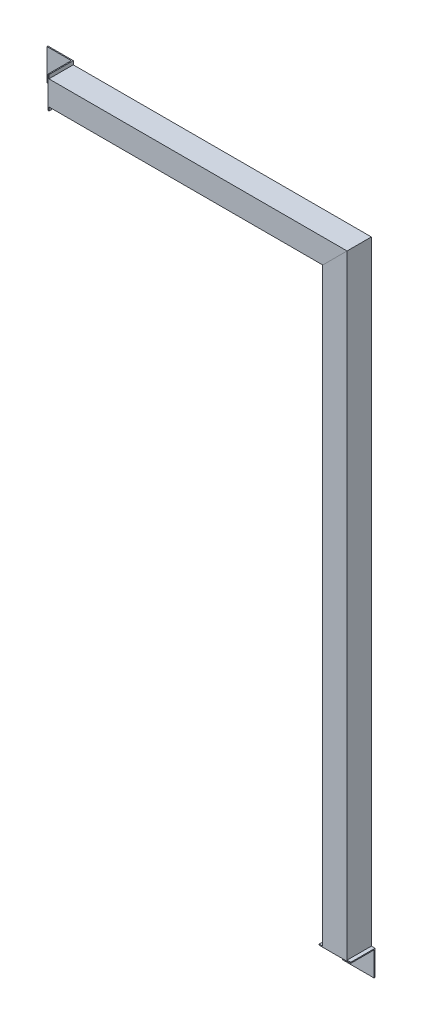
ISO-10303-21;
HEADER;
FILE_DESCRIPTION(('STEP AP214'),'2;1');
FILE_NAME('part.step','',(''),(''),'','','');
FILE_SCHEMA(('AUTOMOTIVE_DESIGN { 1 0 10303 214 1 1 1 1 }'));
ENDSEC;
DATA;
#1=APPLICATION_CONTEXT('core data for automotive mechanical design processes');
#2=APPLICATION_PROTOCOL_DEFINITION('international standard','automotive_design',2000,#1);
#3=PRODUCT_CONTEXT('',#1,'mechanical');
#4=PRODUCT('Part','Part','',(#3));
#5=PRODUCT_RELATED_PRODUCT_CATEGORY('part','',(#4));
#6=PRODUCT_DEFINITION_FORMATION('','',#4);
#7=PRODUCT_DEFINITION_CONTEXT('part definition',#1,'design');
#8=PRODUCT_DEFINITION('design','',#6,#7);
#9=PRODUCT_DEFINITION_SHAPE('','',#8);
#10=(LENGTH_UNIT() NAMED_UNIT(*) SI_UNIT(.MILLI.,.METRE.));
#11=(NAMED_UNIT(*) PLANE_ANGLE_UNIT() SI_UNIT($,.RADIAN.));
#12=(NAMED_UNIT(*) SI_UNIT($,.STERADIAN.) SOLID_ANGLE_UNIT());
#13=UNCERTAINTY_MEASURE_WITH_UNIT(LENGTH_MEASURE(1.E-05),#10,'distance_accuracy_value','');
#14=(GEOMETRIC_REPRESENTATION_CONTEXT(3) GLOBAL_UNCERTAINTY_ASSIGNED_CONTEXT((#13)) GLOBAL_UNIT_ASSIGNED_CONTEXT((#10,
#11,#12)) REPRESENTATION_CONTEXT('',''));
#15=CARTESIAN_POINT('',(0.,0.,0.));
#16=DIRECTION('',(0.,0.,1.));
#17=DIRECTION('',(1.,0.,0.));
#18=AXIS2_PLACEMENT_3D('',#15,#16,#17);
#19=CARTESIAN_POINT('',(-57.5,-50.,23.));
#20=DIRECTION('',(0.,-1.,0.));
#21=DIRECTION('',(1.,0.,0.));
#22=AXIS2_PLACEMENT_3D('',#19,#20,#21);
#23=PLANE('',#22);
#24=DIRECTION('',(0.,0.,1.));
#25=VECTOR('',#24,1.);
#26=CARTESIAN_POINT('',(7.50000000000001,-50.,23.));
#27=LINE('',#26,#25);
#28=CARTESIAN_POINT('',(7.50000000000001,-50.,-25.));
#29=VERTEX_POINT('',#28);
#30=CARTESIAN_POINT('',(7.50000000000001,-50.,-22.9999999999998));
#31=VERTEX_POINT('',#30);
#32=EDGE_CURVE('E232',#29,#31,#27,.T.);
#33=ORIENTED_EDGE('',*,*,#32,.T.);
#34=DIRECTION('',(-1.,0.,0.));
#35=VECTOR('',#34,1.);
#36=CARTESIAN_POINT('',(-57.5,-50.,-22.9999999999998));
#37=LINE('',#36,#35);
#38=CARTESIAN_POINT('',(-57.5,-50.,-22.9999999999998));
#39=VERTEX_POINT('',#38);
#40=EDGE_CURVE('E441',#31,#39,#37,.T.);
#41=ORIENTED_EDGE('',*,*,#40,.T.);
#42=DIRECTION('',(0.,0.,1.));
#43=VECTOR('',#42,1.);
#44=CARTESIAN_POINT('',(-57.5,-50.,23.));
#45=LINE('',#44,#43);
#46=CARTESIAN_POINT('',(-57.5,-50.,-25.));
#47=VERTEX_POINT('',#46);
#48=EDGE_CURVE('E229',#47,#39,#45,.T.);
#49=ORIENTED_EDGE('',*,*,#48,.F.);
#50=DIRECTION('',(1.,0.,0.));
#51=VECTOR('',#50,1.);
#52=CARTESIAN_POINT('',(7.50000000000002,-50.,-25.));
#53=LINE('',#52,#51);
#54=EDGE_CURVE('E419',#47,#29,#53,.T.);
#55=ORIENTED_EDGE('',*,*,#54,.T.);
#56=EDGE_LOOP('',(#33,#41,#49,#55));
#57=FACE_BOUND('',#56,.T.);
#58=ADVANCED_FACE('F41',(#57),#23,.T.);
#59=CARTESIAN_POINT('',(-665.,1272.5,23.));
#60=DIRECTION('',(-1.,0.,0.));
#61=DIRECTION('',(0.,0.,1.));
#62=AXIS2_PLACEMENT_3D('',#59,#60,#61);
#63=PLANE('',#62);
#64=DIRECTION('',(0.,0.,1.));
#65=VECTOR('',#64,1.);
#66=CARTESIAN_POINT('',(-665.,1207.5,23.));
#67=LINE('',#66,#65);
#68=CARTESIAN_POINT('',(-665.,1207.5,-24.9999999999999));
#69=VERTEX_POINT('',#68);
#70=CARTESIAN_POINT('',(-665.,1207.5,-23.));
#71=VERTEX_POINT('',#70);
#72=EDGE_CURVE('E356',#69,#71,#67,.T.);
#73=ORIENTED_EDGE('',*,*,#72,.T.);
#74=DIRECTION('',(0.,1.,0.));
#75=VECTOR('',#74,1.);
#76=CARTESIAN_POINT('',(-665.,1272.5,-23.));
#77=LINE('',#76,#75);
#78=CARTESIAN_POINT('',(-665.,1272.5,-23.));
#79=VERTEX_POINT('',#78);
#80=EDGE_CURVE('E65',#71,#79,#77,.T.);
#81=ORIENTED_EDGE('',*,*,#80,.T.);
#82=DIRECTION('',(0.,0.,1.));
#83=VECTOR('',#82,1.);
#84=CARTESIAN_POINT('',(-665.,1272.5,23.));
#85=LINE('',#84,#83);
#86=CARTESIAN_POINT('',(-665.,1272.5,-24.9999999999999));
#87=VERTEX_POINT('',#86);
#88=EDGE_CURVE('E234',#87,#79,#85,.T.);
#89=ORIENTED_EDGE('',*,*,#88,.F.);
#90=DIRECTION('',(0.,-1.,0.));
#91=VECTOR('',#90,1.);
#92=CARTESIAN_POINT('',(-665.,1207.5,-24.9999999999999));
#93=LINE('',#92,#91);
#94=EDGE_CURVE('E363',#87,#69,#93,.T.);
#95=ORIENTED_EDGE('',*,*,#94,.T.);
#96=EDGE_LOOP('',(#73,#81,#89,#95));
#97=FACE_BOUND('',#96,.T.);
#98=ADVANCED_FACE('F361',(#97),#63,.T.);
#99=CARTESIAN_POINT('',(0.,1265.,25.));
#100=DIRECTION('',(-1.,0.,0.));
#101=DIRECTION('',(0.,0.,1.));
#102=AXIS2_PLACEMENT_3D('',#99,#100,#101);
#103=PLANE('',#102);
#104=DIRECTION('',(0.,-1.,0.));
#105=VECTOR('',#104,1.);
#106=CARTESIAN_POINT('',(0.,1265.,25.));
#107=LINE('',#106,#105);
#108=CARTESIAN_POINT('',(0.,1265.,25.));
#109=VERTEX_POINT('',#108);
#110=CARTESIAN_POINT('',(0.,2.,25.));
#111=VERTEX_POINT('',#110);
#112=EDGE_CURVE('E285',#109,#111,#107,.T.);
#113=ORIENTED_EDGE('',*,*,#112,.T.);
#114=DIRECTION('',(0.,0.,-1.));
#115=VECTOR('',#114,1.);
#116=CARTESIAN_POINT('',(0.,2.,25.));
#117=LINE('',#116,#115);
#118=CARTESIAN_POINT('',(0.,2.,-24.9999999999998));
#119=VERTEX_POINT('',#118);
#120=EDGE_CURVE('E393',#111,#119,#117,.T.);
#121=ORIENTED_EDGE('',*,*,#120,.T.);
#122=DIRECTION('',(0.,-1.,0.));
#123=VECTOR('',#122,1.);
#124=CARTESIAN_POINT('',(0.,1265.,-25.));
#125=LINE('',#124,#123);
#126=CARTESIAN_POINT('',(0.,1265.,-25.));
#127=VERTEX_POINT('',#126);
#128=EDGE_CURVE('E296',#127,#119,#125,.T.);
#129=ORIENTED_EDGE('',*,*,#128,.F.);
#130=DIRECTION('',(0.,0.,-1.));
#131=VECTOR('',#130,1.);
#132=CARTESIAN_POINT('',(0.,1265.,25.));
#133=LINE('',#132,#131);
#134=EDGE_CURVE('E275',#109,#127,#133,.T.);
#135=ORIENTED_EDGE('',*,*,#134,.F.);
#136=EDGE_LOOP('',(#113,#121,#129,#135));
#137=FACE_BOUND('',#136,.T.);
#138=ADVANCED_FACE('F467',(#137),#103,.F.);
#139=CARTESIAN_POINT('',(-50.,1265.,-25.));
#140=DIRECTION('',(0.,0.,1.));
#141=DIRECTION('',(1.,0.,0.));
#142=AXIS2_PLACEMENT_3D('',#139,#140,#141);
#143=PLANE('',#142);
#144=ORIENTED_EDGE('',*,*,#128,.T.);
#145=DIRECTION('',(1.,0.,0.));
#146=VECTOR('',#145,1.);
#147=CARTESIAN_POINT('',(-57.5,2.,-24.9999999999998));
#148=LINE('',#147,#146);
#149=CARTESIAN_POINT('',(7.50000000000001,2.,-24.9999999999998));
#150=VERTEX_POINT('',#149);
#151=EDGE_CURVE('E417',#119,#150,#148,.T.);
#152=ORIENTED_EDGE('',*,*,#151,.T.);
#153=DIRECTION('',(0.,-1.,0.));
#154=VECTOR('',#153,1.);
#155=CARTESIAN_POINT('',(7.50000000000001,0.,-24.9999999999998));
#156=LINE('',#155,#154);
#157=EDGE_CURVE('E410',#150,#29,#156,.T.);
#158=ORIENTED_EDGE('',*,*,#157,.T.);
#159=ORIENTED_EDGE('',*,*,#54,.F.);
#160=DIRECTION('',(0.,1.,0.));
#161=VECTOR('',#160,1.);
#162=CARTESIAN_POINT('',(-57.5,0.,-24.9999999999998));
#163=LINE('',#162,#161);
#164=CARTESIAN_POINT('',(-57.5,2.,-24.9999999999998));
#165=VERTEX_POINT('',#164);
#166=EDGE_CURVE('E404',#47,#165,#163,.T.);
#167=ORIENTED_EDGE('',*,*,#166,.T.);
#168=CARTESIAN_POINT('',(-50.,2.,-25.));
#169=VERTEX_POINT('',#168);
#170=EDGE_CURVE('E414',#165,#169,#148,.T.);
#171=ORIENTED_EDGE('',*,*,#170,.T.);
#172=DIRECTION('',(0.,-1.,0.));
#173=VECTOR('',#172,1.);
#174=CARTESIAN_POINT('',(-50.,1265.,-25.));
#175=LINE('',#174,#173);
#176=CARTESIAN_POINT('',(-50.0000000000003,1215.,-25.));
#177=VERTEX_POINT('',#176);
#178=EDGE_CURVE('E299',#177,#169,#175,.T.);
#179=ORIENTED_EDGE('',*,*,#178,.F.);
#180=DIRECTION('',(0.707106781186548,0.707106781186548,0.));
#181=VECTOR('',#180,1.);
#182=CARTESIAN_POINT('',(-332.5,932.5,-25.));
#183=LINE('',#182,#181);
#184=EDGE_CURVE('E288',#177,#127,#183,.T.);
#185=ORIENTED_EDGE('',*,*,#184,.T.);
#186=EDGE_LOOP('',(#144,#152,#158,#159,#167,#171,#179,#185));
#187=FACE_BOUND('',#186,.T.);
#188=ADVANCED_FACE('F450',(#187),#143,.F.);
#189=CARTESIAN_POINT('',(-50.,1265.,25.));
#190=DIRECTION('',(1.,0.,0.));
#191=DIRECTION('',(0.,1.,0.));
#192=AXIS2_PLACEMENT_3D('',#189,#190,#191);
#193=PLANE('',#192);
#194=ORIENTED_EDGE('',*,*,#178,.T.);
#195=DIRECTION('',(0.,0.,1.));
#196=VECTOR('',#195,1.);
#197=CARTESIAN_POINT('',(-50.,2.,25.));
#198=LINE('',#197,#196);
#199=CARTESIAN_POINT('',(-50.,2.,25.));
#200=VERTEX_POINT('',#199);
#201=EDGE_CURVE('E396',#169,#200,#198,.T.);
#202=ORIENTED_EDGE('',*,*,#201,.T.);
#203=DIRECTION('',(0.,-1.,0.));
#204=VECTOR('',#203,1.);
#205=CARTESIAN_POINT('',(-50.,1265.,25.));
#206=LINE('',#205,#204);
#207=CARTESIAN_POINT('',(-50.0000000000002,1215.,25.));
#208=VERTEX_POINT('',#207);
#209=EDGE_CURVE('E239',#208,#200,#206,.T.);
#210=ORIENTED_EDGE('',*,*,#209,.F.);
#211=DIRECTION('',(0.,0.,-1.));
#212=VECTOR('',#211,1.);
#213=CARTESIAN_POINT('',(-50.0000000000004,1215.,25.));
#214=LINE('',#213,#212);
#215=EDGE_CURVE('E284',#208,#177,#214,.T.);
#216=ORIENTED_EDGE('',*,*,#215,.T.);
#217=EDGE_LOOP('',(#194,#202,#210,#216));
#218=FACE_BOUND('',#217,.T.);
#219=ADVANCED_FACE('F514',(#218),#193,.F.);
#220=CARTESIAN_POINT('',(-50.,1265.,25.));
#221=DIRECTION('',(0.,0.,-1.));
#222=DIRECTION('',(-1.,0.,0.));
#223=AXIS2_PLACEMENT_3D('',#220,#221,#222);
#224=PLANE('',#223);
#225=DIRECTION('',(0.,-1.,0.));
#226=VECTOR('',#225,1.);
#227=CARTESIAN_POINT('',(-57.5,0.,25.));
#228=LINE('',#227,#226);
#229=CARTESIAN_POINT('',(-57.5,2.,25.));
#230=VERTEX_POINT('',#229);
#231=CARTESIAN_POINT('',(-57.5,0.,25.));
#232=VERTEX_POINT('',#231);
#233=EDGE_CURVE('E222',#230,#232,#228,.T.);
#234=ORIENTED_EDGE('',*,*,#233,.T.);
#235=DIRECTION('',(-1.,0.,0.));
#236=VECTOR('',#235,1.);
#237=CARTESIAN_POINT('',(-57.5,0.,25.));
#238=LINE('',#237,#236);
#239=CARTESIAN_POINT('',(7.50000000000001,0.,25.));
#240=VERTEX_POINT('',#239);
#241=EDGE_CURVE('E207',#240,#232,#238,.T.);
#242=ORIENTED_EDGE('',*,*,#241,.F.);
#243=DIRECTION('',(0.,1.,0.));
#244=VECTOR('',#243,1.);
#245=CARTESIAN_POINT('',(7.49999999999999,0.,25.));
#246=LINE('',#245,#244);
#247=CARTESIAN_POINT('',(7.50000000000001,2.,25.));
#248=VERTEX_POINT('',#247);
#249=EDGE_CURVE('E219',#240,#248,#246,.T.);
#250=ORIENTED_EDGE('',*,*,#249,.T.);
#251=DIRECTION('',(-1.,0.,0.));
#252=VECTOR('',#251,1.);
#253=CARTESIAN_POINT('',(-57.5,2.,25.));
#254=LINE('',#253,#252);
#255=EDGE_CURVE('E407',#248,#111,#254,.T.);
#256=ORIENTED_EDGE('',*,*,#255,.T.);
#257=ORIENTED_EDGE('',*,*,#112,.F.);
#258=DIRECTION('',(-0.707106781186548,-0.707106781186548,0.));
#259=VECTOR('',#258,1.);
#260=CARTESIAN_POINT('',(-332.5,932.5,25.));
#261=LINE('',#260,#259);
#262=EDGE_CURVE('E281',#109,#208,#261,.T.);
#263=ORIENTED_EDGE('',*,*,#262,.T.);
#264=ORIENTED_EDGE('',*,*,#209,.T.);
#265=EDGE_CURVE('E412',#200,#230,#254,.T.);
#266=ORIENTED_EDGE('',*,*,#265,.T.);
#267=EDGE_LOOP('',(#234,#242,#250,#256,#257,#263,#264,#266));
#268=FACE_BOUND('',#267,.T.);
#269=ADVANCED_FACE('F43',(#268),#224,.F.);
#270=CARTESIAN_POINT('',(-615.,1265.,25.));
#271=DIRECTION('',(0.,-1.,0.));
#272=DIRECTION('',(0.,0.,-1.));
#273=AXIS2_PLACEMENT_3D('',#270,#271,#272);
#274=PLANE('',#273);
#275=DIRECTION('',(1.,0.,0.));
#276=VECTOR('',#275,1.);
#277=CARTESIAN_POINT('',(-615.,1265.,-25.));
#278=LINE('',#277,#276);
#279=CARTESIAN_POINT('',(-613.,1265.,-25.));
#280=VERTEX_POINT('',#279);
#281=EDGE_CURVE('E276',#280,#127,#278,.T.);
#282=ORIENTED_EDGE('',*,*,#281,.F.);
#283=DIRECTION('',(0.,0.,1.));
#284=VECTOR('',#283,1.);
#285=CARTESIAN_POINT('',(-613.,1265.,25.));
#286=LINE('',#285,#284);
#287=CARTESIAN_POINT('',(-613.,1265.,25.));
#288=VERTEX_POINT('',#287);
#289=EDGE_CURVE('E348',#280,#288,#286,.T.);
#290=ORIENTED_EDGE('',*,*,#289,.T.);
#291=DIRECTION('',(1.,0.,0.));
#292=VECTOR('',#291,1.);
#293=CARTESIAN_POINT('',(-615.,1265.,25.));
#294=LINE('',#293,#292);
#295=EDGE_CURVE('E266',#288,#109,#294,.T.);
#296=ORIENTED_EDGE('',*,*,#295,.T.);
#297=ORIENTED_EDGE('',*,*,#134,.T.);
#298=EDGE_LOOP('',(#282,#290,#296,#297));
#299=FACE_BOUND('',#298,.T.);
#300=ADVANCED_FACE('F497',(#299),#274,.F.);
#301=CARTESIAN_POINT('',(-615.,1215.,-25.));
#302=DIRECTION('',(0.,0.,1.));
#303=DIRECTION('',(0.,-1.,0.));
#304=AXIS2_PLACEMENT_3D('',#301,#302,#303);
#305=PLANE('',#304);
#306=DIRECTION('',(1.,0.,0.));
#307=VECTOR('',#306,1.);
#308=CARTESIAN_POINT('',(-615.,1215.,-25.));
#309=LINE('',#308,#307);
#310=CARTESIAN_POINT('',(-613.,1215.,-25.));
#311=VERTEX_POINT('',#310);
#312=EDGE_CURVE('E278',#311,#177,#309,.T.);
#313=ORIENTED_EDGE('',*,*,#312,.F.);
#314=DIRECTION('',(0.,-1.,0.));
#315=VECTOR('',#314,1.);
#316=CARTESIAN_POINT('',(-613.,1272.5,-25.));
#317=LINE('',#316,#315);
#318=CARTESIAN_POINT('',(-613.,1207.5,-25.));
#319=VERTEX_POINT('',#318);
#320=EDGE_CURVE('E373',#311,#319,#317,.T.);
#321=ORIENTED_EDGE('',*,*,#320,.T.);
#322=DIRECTION('',(-1.,0.,0.));
#323=VECTOR('',#322,1.);
#324=CARTESIAN_POINT('',(-615.,1207.5,-25.));
#325=LINE('',#324,#323);
#326=EDGE_CURVE('E336',#319,#69,#325,.T.);
#327=ORIENTED_EDGE('',*,*,#326,.T.);
#328=ORIENTED_EDGE('',*,*,#94,.F.);
#329=DIRECTION('',(1.,0.,0.));
#330=VECTOR('',#329,1.);
#331=CARTESIAN_POINT('',(-615.,1272.5,-25.));
#332=LINE('',#331,#330);
#333=CARTESIAN_POINT('',(-613.,1272.5,-25.));
#334=VERTEX_POINT('',#333);
#335=EDGE_CURVE('E340',#87,#334,#332,.T.);
#336=ORIENTED_EDGE('',*,*,#335,.T.);
#337=EDGE_CURVE('E377',#334,#280,#317,.T.);
#338=ORIENTED_EDGE('',*,*,#337,.T.);
#339=ORIENTED_EDGE('',*,*,#281,.T.);
#340=ORIENTED_EDGE('',*,*,#184,.F.);
#341=EDGE_LOOP('',(#313,#321,#327,#328,#336,#338,#339,#340));
#342=FACE_BOUND('',#341,.T.);
#343=ADVANCED_FACE('F372',(#342),#305,.F.);
#344=CARTESIAN_POINT('',(-615.,1215.,25.));
#345=DIRECTION('',(0.,1.,0.));
#346=DIRECTION('',(0.,0.,1.));
#347=AXIS2_PLACEMENT_3D('',#344,#345,#346);
#348=PLANE('',#347);
#349=DIRECTION('',(1.,0.,0.));
#350=VECTOR('',#349,1.);
#351=CARTESIAN_POINT('',(-615.,1215.,25.));
#352=LINE('',#351,#350);
#353=CARTESIAN_POINT('',(-613.,1215.,25.));
#354=VERTEX_POINT('',#353);
#355=EDGE_CURVE('E291',#354,#208,#352,.T.);
#356=ORIENTED_EDGE('',*,*,#355,.F.);
#357=DIRECTION('',(0.,0.,-1.));
#358=VECTOR('',#357,1.);
#359=CARTESIAN_POINT('',(-613.,1215.,25.));
#360=LINE('',#359,#358);
#361=EDGE_CURVE('E345',#354,#311,#360,.T.);
#362=ORIENTED_EDGE('',*,*,#361,.T.);
#363=ORIENTED_EDGE('',*,*,#312,.T.);
#364=ORIENTED_EDGE('',*,*,#215,.F.);
#365=EDGE_LOOP('',(#356,#362,#363,#364));
#366=FACE_BOUND('',#365,.T.);
#367=ADVANCED_FACE('F503',(#366),#348,.F.);
#368=CARTESIAN_POINT('',(-615.,1215.,25.));
#369=DIRECTION('',(0.,0.,-1.));
#370=DIRECTION('',(-1.,0.,0.));
#371=AXIS2_PLACEMENT_3D('',#368,#369,#370);
#372=PLANE('',#371);
#373=DIRECTION('',(-1.,0.,0.));
#374=VECTOR('',#373,1.);
#375=CARTESIAN_POINT('',(-665.,1272.5,25.));
#376=LINE('',#375,#374);
#377=CARTESIAN_POINT('',(-613.,1272.5,25.));
#378=VERTEX_POINT('',#377);
#379=CARTESIAN_POINT('',(-615.,1272.5,25.));
#380=VERTEX_POINT('',#379);
#381=EDGE_CURVE('E353',#378,#380,#376,.T.);
#382=ORIENTED_EDGE('',*,*,#381,.T.);
#383=DIRECTION('',(0.,1.,0.));
#384=VECTOR('',#383,1.);
#385=CARTESIAN_POINT('',(-615.,1272.5,25.));
#386=LINE('',#385,#384);
#387=CARTESIAN_POINT('',(-615.,1207.5,25.));
#388=VERTEX_POINT('',#387);
#389=EDGE_CURVE('E427',#388,#380,#386,.T.);
#390=ORIENTED_EDGE('',*,*,#389,.F.);
#391=DIRECTION('',(1.,0.,0.));
#392=VECTOR('',#391,1.);
#393=CARTESIAN_POINT('',(-665.,1207.5,25.));
#394=LINE('',#393,#392);
#395=CARTESIAN_POINT('',(-613.,1207.5,25.));
#396=VERTEX_POINT('',#395);
#397=EDGE_CURVE('E351',#388,#396,#394,.T.);
#398=ORIENTED_EDGE('',*,*,#397,.T.);
#399=DIRECTION('',(0.,1.,0.));
#400=VECTOR('',#399,1.);
#401=CARTESIAN_POINT('',(-613.,1272.5,25.));
#402=LINE('',#401,#400);
#403=EDGE_CURVE('E384',#396,#354,#402,.T.);
#404=ORIENTED_EDGE('',*,*,#403,.T.);
#405=ORIENTED_EDGE('',*,*,#355,.T.);
#406=ORIENTED_EDGE('',*,*,#262,.F.);
#407=ORIENTED_EDGE('',*,*,#295,.F.);
#408=EDGE_CURVE('E388',#288,#378,#402,.T.);
#409=ORIENTED_EDGE('',*,*,#408,.T.);
#410=EDGE_LOOP('',(#382,#390,#398,#404,#405,#406,#407,#409));
#411=FACE_BOUND('',#410,.T.);
#412=ADVANCED_FACE('F469',(#411),#372,.F.);
#413=CARTESIAN_POINT('',(-57.5,0.,23.));
#414=DIRECTION('',(-1.,0.,0.));
#415=DIRECTION('',(0.,-1.,0.));
#416=AXIS2_PLACEMENT_3D('',#413,#414,#415);
#417=PLANE('',#416);
#418=DIRECTION('',(0.,0.,1.));
#419=VECTOR('',#418,1.);
#420=CARTESIAN_POINT('',(-57.5,0.,-107.006097334284));
#421=LINE('',#420,#419);
#422=CARTESIAN_POINT('',(-57.5,0.,-22.9999999999998));
#423=VERTEX_POINT('',#422);
#424=EDGE_CURVE('E214',#423,#232,#421,.T.);
#425=ORIENTED_EDGE('',*,*,#424,.T.);
#426=ORIENTED_EDGE('',*,*,#233,.F.);
#427=DIRECTION('',(0.,0.,1.));
#428=VECTOR('',#427,1.);
#429=CARTESIAN_POINT('',(-57.5,2.,-90.0307619515564));
#430=LINE('',#429,#428);
#431=EDGE_CURVE('E406',#165,#230,#430,.T.);
#432=ORIENTED_EDGE('',*,*,#431,.F.);
#433=ORIENTED_EDGE('',*,*,#166,.F.);
#434=ORIENTED_EDGE('',*,*,#48,.T.);
#435=DIRECTION('',(0.,1.,0.));
#436=VECTOR('',#435,1.);
#437=CARTESIAN_POINT('',(-57.5,0.,-22.9999999999998));
#438=LINE('',#437,#436);
#439=EDGE_CURVE('E57',#39,#423,#438,.T.);
#440=ORIENTED_EDGE('',*,*,#439,.T.);
#441=EDGE_LOOP('',(#425,#426,#432,#433,#434,#440));
#442=FACE_BOUND('',#441,.T.);
#443=ADVANCED_FACE('F444',(#442),#417,.T.);
#444=CARTESIAN_POINT('',(7.49999999999999,0.,23.));
#445=DIRECTION('',(1.,0.,0.));
#446=DIRECTION('',(0.,1.,0.));
#447=AXIS2_PLACEMENT_3D('',#444,#445,#446);
#448=PLANE('',#447);
#449=DIRECTION('',(0.,0.,1.));
#450=VECTOR('',#449,1.);
#451=CARTESIAN_POINT('',(7.50000000000001,0.,-107.006097334284));
#452=LINE('',#451,#450);
#453=CARTESIAN_POINT('',(7.50000000000001,0.,-22.9999999999998));
#454=VERTEX_POINT('',#453);
#455=EDGE_CURVE('E204',#454,#240,#452,.T.);
#456=ORIENTED_EDGE('',*,*,#455,.F.);
#457=DIRECTION('',(0.,-1.,0.));
#458=VECTOR('',#457,1.);
#459=CARTESIAN_POINT('',(7.50000000000001,0.,-22.9999999999998));
#460=LINE('',#459,#458);
#461=EDGE_CURVE('E437',#454,#31,#460,.T.);
#462=ORIENTED_EDGE('',*,*,#461,.T.);
#463=ORIENTED_EDGE('',*,*,#32,.F.);
#464=ORIENTED_EDGE('',*,*,#157,.F.);
#465=DIRECTION('',(0.,0.,1.));
#466=VECTOR('',#465,1.);
#467=CARTESIAN_POINT('',(7.50000000000001,2.,-90.0307619515564));
#468=LINE('',#467,#466);
#469=EDGE_CURVE('E227',#150,#248,#468,.T.);
#470=ORIENTED_EDGE('',*,*,#469,.T.);
#471=ORIENTED_EDGE('',*,*,#249,.F.);
#472=EDGE_LOOP('',(#456,#462,#463,#464,#470,#471));
#473=FACE_BOUND('',#472,.T.);
#474=ADVANCED_FACE('F224',(#473),#448,.T.);
#475=CARTESIAN_POINT('',(-665.,1272.5,23.));
#476=DIRECTION('',(0.,1.,0.));
#477=DIRECTION('',(0.,0.,1.));
#478=AXIS2_PLACEMENT_3D('',#475,#476,#477);
#479=PLANE('',#478);
#480=DIRECTION('',(0.,0.,1.));
#481=VECTOR('',#480,1.);
#482=CARTESIAN_POINT('',(-615.,1272.5,-107.006097334284));
#483=LINE('',#482,#481);
#484=CARTESIAN_POINT('',(-615.,1272.5,-23.));
#485=VERTEX_POINT('',#484);
#486=EDGE_CURVE('E426',#485,#380,#483,.T.);
#487=ORIENTED_EDGE('',*,*,#486,.T.);
#488=ORIENTED_EDGE('',*,*,#381,.F.);
#489=DIRECTION('',(0.,0.,1.));
#490=VECTOR('',#489,1.);
#491=CARTESIAN_POINT('',(-613.,1272.5,-90.0307619515564));
#492=LINE('',#491,#490);
#493=EDGE_CURVE('E378',#334,#378,#492,.T.);
#494=ORIENTED_EDGE('',*,*,#493,.F.);
#495=ORIENTED_EDGE('',*,*,#335,.F.);
#496=ORIENTED_EDGE('',*,*,#88,.T.);
#497=DIRECTION('',(1.,0.,0.));
#498=VECTOR('',#497,1.);
#499=CARTESIAN_POINT('',(-665.,1272.5,-23.));
#500=LINE('',#499,#498);
#501=EDGE_CURVE('E433',#79,#485,#500,.T.);
#502=ORIENTED_EDGE('',*,*,#501,.T.);
#503=EDGE_LOOP('',(#487,#488,#494,#495,#496,#502));
#504=FACE_BOUND('',#503,.T.);
#505=ADVANCED_FACE('F559',(#504),#479,.T.);
#506=CARTESIAN_POINT('',(-665.,1207.5,23.));
#507=DIRECTION('',(0.,-1.,0.));
#508=DIRECTION('',(0.,0.,-1.));
#509=AXIS2_PLACEMENT_3D('',#506,#507,#508);
#510=PLANE('',#509);
#511=DIRECTION('',(0.,0.,1.));
#512=VECTOR('',#511,1.);
#513=CARTESIAN_POINT('',(-615.,1207.5,-107.006097334284));
#514=LINE('',#513,#512);
#515=CARTESIAN_POINT('',(-615.,1207.5,-23.));
#516=VERTEX_POINT('',#515);
#517=EDGE_CURVE('E424',#516,#388,#514,.T.);
#518=ORIENTED_EDGE('',*,*,#517,.F.);
#519=DIRECTION('',(-1.,0.,0.));
#520=VECTOR('',#519,1.);
#521=CARTESIAN_POINT('',(-665.,1207.5,-23.));
#522=LINE('',#521,#520);
#523=EDGE_CURVE('E369',#516,#71,#522,.T.);
#524=ORIENTED_EDGE('',*,*,#523,.T.);
#525=ORIENTED_EDGE('',*,*,#72,.F.);
#526=ORIENTED_EDGE('',*,*,#326,.F.);
#527=DIRECTION('',(0.,0.,1.));
#528=VECTOR('',#527,1.);
#529=CARTESIAN_POINT('',(-613.,1207.5,-90.0307619515564));
#530=LINE('',#529,#528);
#531=EDGE_CURVE('E381',#319,#396,#530,.T.);
#532=ORIENTED_EDGE('',*,*,#531,.T.);
#533=ORIENTED_EDGE('',*,*,#397,.F.);
#534=EDGE_LOOP('',(#518,#524,#525,#526,#532,#533));
#535=FACE_BOUND('',#534,.T.);
#536=ADVANCED_FACE('F367',(#535),#510,.T.);
#537=CARTESIAN_POINT('',(-613.,1272.5,-90.0307619515564));
#538=DIRECTION('',(1.,0.,0.));
#539=DIRECTION('',(0.,0.,-1.));
#540=AXIS2_PLACEMENT_3D('',#537,#538,#539);
#541=PLANE('',#540);
#542=ORIENTED_EDGE('',*,*,#361,.F.);
#543=ORIENTED_EDGE('',*,*,#403,.F.);
#544=ORIENTED_EDGE('',*,*,#531,.F.);
#545=ORIENTED_EDGE('',*,*,#320,.F.);
#546=EDGE_LOOP('',(#542,#543,#544,#545));
#547=FACE_BOUND('',#546,.T.);
#548=ADVANCED_FACE('F382',(#547),#541,.T.);
#549=ORIENTED_EDGE('',*,*,#289,.F.);
#550=ORIENTED_EDGE('',*,*,#337,.F.);
#551=ORIENTED_EDGE('',*,*,#493,.T.);
#552=ORIENTED_EDGE('',*,*,#408,.F.);
#553=EDGE_LOOP('',(#549,#550,#551,#552));
#554=FACE_BOUND('',#553,.T.);
#555=ADVANCED_FACE('F538',(#554),#541,.T.);
#556=CARTESIAN_POINT('',(-57.5,2.,-90.0307619515564));
#557=DIRECTION('',(0.,1.,0.));
#558=DIRECTION('',(0.,0.,1.));
#559=AXIS2_PLACEMENT_3D('',#556,#557,#558);
#560=PLANE('',#559);
#561=ORIENTED_EDGE('',*,*,#120,.F.);
#562=ORIENTED_EDGE('',*,*,#255,.F.);
#563=ORIENTED_EDGE('',*,*,#469,.F.);
#564=ORIENTED_EDGE('',*,*,#151,.F.);
#565=EDGE_LOOP('',(#561,#562,#563,#564));
#566=FACE_BOUND('',#565,.T.);
#567=ADVANCED_FACE('F536',(#566),#560,.T.);
#568=ORIENTED_EDGE('',*,*,#201,.F.);
#569=ORIENTED_EDGE('',*,*,#170,.F.);
#570=ORIENTED_EDGE('',*,*,#431,.T.);
#571=ORIENTED_EDGE('',*,*,#265,.F.);
#572=EDGE_LOOP('',(#568,#569,#570,#571));
#573=FACE_BOUND('',#572,.T.);
#574=ADVANCED_FACE('F526',(#573),#560,.T.);
#575=CARTESIAN_POINT('',(-615.,1272.5,-107.006097334284));
#576=DIRECTION('',(1.,0.,0.));
#577=DIRECTION('',(0.,0.,-1.));
#578=AXIS2_PLACEMENT_3D('',#575,#576,#577);
#579=PLANE('',#578);
#580=DIRECTION('',(0.,-1.,0.));
#581=VECTOR('',#580,1.);
#582=CARTESIAN_POINT('',(-615.,1272.5,-23.));
#583=LINE('',#582,#581);
#584=EDGE_CURVE('E430',#485,#516,#583,.T.);
#585=ORIENTED_EDGE('',*,*,#584,.T.);
#586=ORIENTED_EDGE('',*,*,#517,.T.);
#587=ORIENTED_EDGE('',*,*,#389,.T.);
#588=ORIENTED_EDGE('',*,*,#486,.F.);
#589=EDGE_LOOP('',(#585,#586,#587,#588));
#590=FACE_BOUND('',#589,.T.);
#591=ADVANCED_FACE('F544',(#590),#579,.F.);
#592=CARTESIAN_POINT('',(-615.,1215.,-23.));
#593=DIRECTION('',(0.,0.,1.));
#594=DIRECTION('',(0.,-1.,0.));
#595=AXIS2_PLACEMENT_3D('',#592,#593,#594);
#596=PLANE('',#595);
#597=ORIENTED_EDGE('',*,*,#80,.F.);
#598=ORIENTED_EDGE('',*,*,#523,.F.);
#599=ORIENTED_EDGE('',*,*,#584,.F.);
#600=ORIENTED_EDGE('',*,*,#501,.F.);
#601=EDGE_LOOP('',(#597,#598,#599,#600));
#602=FACE_BOUND('',#601,.T.);
#603=ADVANCED_FACE('F460',(#602),#596,.T.);
#604=CARTESIAN_POINT('',(-57.5,0.,-107.006097334284));
#605=DIRECTION('',(0.,1.,0.));
#606=DIRECTION('',(0.,0.,1.));
#607=AXIS2_PLACEMENT_3D('',#604,#605,#606);
#608=PLANE('',#607);
#609=DIRECTION('',(1.,0.,0.));
#610=VECTOR('',#609,1.);
#611=CARTESIAN_POINT('',(-57.5,0.,-22.9999999999998));
#612=LINE('',#611,#610);
#613=EDGE_CURVE('E209',#423,#454,#612,.T.);
#614=ORIENTED_EDGE('',*,*,#613,.T.);
#615=ORIENTED_EDGE('',*,*,#455,.T.);
#616=ORIENTED_EDGE('',*,*,#241,.T.);
#617=ORIENTED_EDGE('',*,*,#424,.F.);
#618=EDGE_LOOP('',(#614,#615,#616,#617));
#619=FACE_BOUND('',#618,.T.);
#620=ADVANCED_FACE('F206',(#619),#608,.F.);
#621=CARTESIAN_POINT('',(-615.,1215.,-23.));
#622=DIRECTION('',(0.,0.,1.));
#623=DIRECTION('',(0.,-1.,0.));
#624=AXIS2_PLACEMENT_3D('',#621,#622,#623);
#625=PLANE('',#624);
#626=ORIENTED_EDGE('',*,*,#461,.F.);
#627=ORIENTED_EDGE('',*,*,#613,.F.);
#628=ORIENTED_EDGE('',*,*,#439,.F.);
#629=ORIENTED_EDGE('',*,*,#40,.F.);
#630=EDGE_LOOP('',(#626,#627,#628,#629));
#631=FACE_BOUND('',#630,.T.);
#632=ADVANCED_FACE('F453',(#631),#625,.T.);
#633=CLOSED_SHELL('',(#58,#98,#138,#188,#219,#269,#300,#343,#367,#412,#443,#474,#505,#536,#548,
#555,#567,#574,#591,#603,#620,#632));
#634=DIRECTION('',(0.,1.,0.));
#635=VECTOR('',#634,1.);
#636=CARTESIAN_POINT('',(-613.,1217.,23.));
#637=LINE('',#636,#635);
#638=CARTESIAN_POINT('',(-613.,1217.,23.));
#639=VERTEX_POINT('',#638);
#640=CARTESIAN_POINT('',(-613.,1263.,23.));
#641=VERTEX_POINT('',#640);
#642=EDGE_CURVE('E314',#639,#641,#637,.T.);
#643=ORIENTED_EDGE('',*,*,#642,.F.);
#644=DIRECTION('',(0.,0.,1.));
#645=VECTOR('',#644,1.);
#646=CARTESIAN_POINT('',(-613.,1217.,23.));
#647=LINE('',#646,#645);
#648=CARTESIAN_POINT('',(-613.,1217.,-23.));
#649=VERTEX_POINT('',#648);
#650=EDGE_CURVE('E50',#649,#639,#647,.T.);
#651=ORIENTED_EDGE('',*,*,#650,.F.);
#652=DIRECTION('',(0.,-1.,0.));
#653=VECTOR('',#652,1.);
#654=CARTESIAN_POINT('',(-613.,1217.,-23.));
#655=LINE('',#654,#653);
#656=CARTESIAN_POINT('',(-613.,1263.,-23.));
#657=VERTEX_POINT('',#656);
#658=EDGE_CURVE('E333',#657,#649,#655,.T.);
#659=ORIENTED_EDGE('',*,*,#658,.F.);
#660=DIRECTION('',(0.,0.,-1.));
#661=VECTOR('',#660,1.);
#662=CARTESIAN_POINT('',(-613.,1263.,23.));
#663=LINE('',#662,#661);
#664=EDGE_CURVE('E335',#641,#657,#663,.T.);
#665=ORIENTED_EDGE('',*,*,#664,.F.);
#666=EDGE_LOOP('',(#643,#651,#659,#665));
#667=FACE_BOUND('',#666,.T.);
#668=ADVANCED_FACE('F476',(#667),#541,.T.);
#669=CARTESIAN_POINT('',(-615.,1217.,23.));
#670=DIRECTION('',(0.,-1.,0.));
#671=DIRECTION('',(0.,0.,-1.));
#672=AXIS2_PLACEMENT_3D('',#669,#670,#671);
#673=PLANE('',#672);
#674=DIRECTION('',(1.,0.,0.));
#675=VECTOR('',#674,1.);
#676=CARTESIAN_POINT('',(-615.,1217.,-23.));
#677=LINE('',#676,#675);
#678=CARTESIAN_POINT('',(-48.0000000000001,1217.,-23.));
#679=VERTEX_POINT('',#678);
#680=EDGE_CURVE('E251',#649,#679,#677,.T.);
#681=ORIENTED_EDGE('',*,*,#680,.F.);
#682=ORIENTED_EDGE('',*,*,#650,.T.);
#683=DIRECTION('',(1.,0.,0.));
#684=VECTOR('',#683,1.);
#685=CARTESIAN_POINT('',(-615.,1217.,23.));
#686=LINE('',#685,#684);
#687=CARTESIAN_POINT('',(-48.0000000000001,1217.,23.));
#688=VERTEX_POINT('',#687);
#689=EDGE_CURVE('E254',#639,#688,#686,.T.);
#690=ORIENTED_EDGE('',*,*,#689,.T.);
#691=DIRECTION('',(0.,0.,1.));
#692=VECTOR('',#691,1.);
#693=CARTESIAN_POINT('',(-48.0000000000003,1217.,23.));
#694=LINE('',#693,#692);
#695=EDGE_CURVE('E250',#679,#688,#694,.T.);
#696=ORIENTED_EDGE('',*,*,#695,.F.);
#697=EDGE_LOOP('',(#681,#682,#690,#696));
#698=FACE_BOUND('',#697,.T.);
#699=ADVANCED_FACE('F306',(#698),#673,.F.);
#700=CARTESIAN_POINT('',(-615.,1217.,-23.));
#701=DIRECTION('',(0.,0.,-1.));
#702=DIRECTION('',(0.,1.,0.));
#703=AXIS2_PLACEMENT_3D('',#700,#701,#702);
#704=PLANE('',#703);
#705=DIRECTION('',(1.,0.,0.));
#706=VECTOR('',#705,1.);
#707=CARTESIAN_POINT('',(-615.,1263.,-23.));
#708=LINE('',#707,#706);
#709=CARTESIAN_POINT('',(-2.00000000000019,1263.,-23.));
#710=VERTEX_POINT('',#709);
#711=EDGE_CURVE('E253',#657,#710,#708,.T.);
#712=ORIENTED_EDGE('',*,*,#711,.F.);
#713=ORIENTED_EDGE('',*,*,#658,.T.);
#714=ORIENTED_EDGE('',*,*,#680,.T.);
#715=DIRECTION('',(-0.707106781186548,-0.707106781186548,0.));
#716=VECTOR('',#715,1.);
#717=CARTESIAN_POINT('',(-331.5,933.5,-23.));
#718=LINE('',#717,#716);
#719=EDGE_CURVE('E241',#710,#679,#718,.T.);
#720=ORIENTED_EDGE('',*,*,#719,.F.);
#721=EDGE_LOOP('',(#712,#713,#714,#720));
#722=FACE_BOUND('',#721,.T.);
#723=ADVANCED_FACE('F332',(#722),#704,.F.);
#724=CARTESIAN_POINT('',(-615.,1263.,23.));
#725=DIRECTION('',(0.,1.,0.));
#726=DIRECTION('',(0.,0.,1.));
#727=AXIS2_PLACEMENT_3D('',#724,#725,#726);
#728=PLANE('',#727);
#729=DIRECTION('',(1.,0.,0.));
#730=VECTOR('',#729,1.);
#731=CARTESIAN_POINT('',(-615.,1263.,23.));
#732=LINE('',#731,#730);
#733=CARTESIAN_POINT('',(-2.00000000000011,1263.,23.));
#734=VERTEX_POINT('',#733);
#735=EDGE_CURVE('E258',#641,#734,#732,.T.);
#736=ORIENTED_EDGE('',*,*,#735,.F.);
#737=ORIENTED_EDGE('',*,*,#664,.T.);
#738=ORIENTED_EDGE('',*,*,#711,.T.);
#739=DIRECTION('',(0.,0.,-1.));
#740=VECTOR('',#739,1.);
#741=CARTESIAN_POINT('',(-2.00000000000022,1263.,23.));
#742=LINE('',#741,#740);
#743=EDGE_CURVE('E244',#734,#710,#742,.T.);
#744=ORIENTED_EDGE('',*,*,#743,.F.);
#745=EDGE_LOOP('',(#736,#737,#738,#744));
#746=FACE_BOUND('',#745,.T.);
#747=ADVANCED_FACE('F480',(#746),#728,.F.);
#748=CARTESIAN_POINT('',(-615.,1217.,23.));
#749=DIRECTION('',(0.,0.,1.));
#750=DIRECTION('',(1.,0.,0.));
#751=AXIS2_PLACEMENT_3D('',#748,#749,#750);
#752=PLANE('',#751);
#753=ORIENTED_EDGE('',*,*,#689,.F.);
#754=ORIENTED_EDGE('',*,*,#642,.T.);
#755=ORIENTED_EDGE('',*,*,#735,.T.);
#756=DIRECTION('',(0.707106781186548,0.707106781186548,0.));
#757=VECTOR('',#756,1.);
#758=CARTESIAN_POINT('',(-331.5,933.5,23.));
#759=LINE('',#758,#757);
#760=EDGE_CURVE('E247',#688,#734,#759,.T.);
#761=ORIENTED_EDGE('',*,*,#760,.F.);
#762=EDGE_LOOP('',(#753,#754,#755,#761));
#763=FACE_BOUND('',#762,.T.);
#764=ADVANCED_FACE('F313',(#763),#752,.F.);
#765=CARTESIAN_POINT('',(-48.,1265.,23.));
#766=DIRECTION('',(0.,0.,1.));
#767=DIRECTION('',(1.,0.,0.));
#768=AXIS2_PLACEMENT_3D('',#765,#766,#767);
#769=PLANE('',#768);
#770=DIRECTION('',(0.,-1.,0.));
#771=VECTOR('',#770,1.);
#772=CARTESIAN_POINT('',(-2.,1265.,23.));
#773=LINE('',#772,#771);
#774=CARTESIAN_POINT('',(-2.,2.,23.));
#775=VERTEX_POINT('',#774);
#776=EDGE_CURVE('E262',#734,#775,#773,.T.);
#777=ORIENTED_EDGE('',*,*,#776,.T.);
#778=DIRECTION('',(-1.,0.,0.));
#779=VECTOR('',#778,1.);
#780=CARTESIAN_POINT('',(-48.,2.,23.));
#781=LINE('',#780,#779);
#782=CARTESIAN_POINT('',(-48.,2.,23.));
#783=VERTEX_POINT('',#782);
#784=EDGE_CURVE('E12',#775,#783,#781,.T.);
#785=ORIENTED_EDGE('',*,*,#784,.T.);
#786=DIRECTION('',(0.,-1.,0.));
#787=VECTOR('',#786,1.);
#788=CARTESIAN_POINT('',(-48.,1265.,23.));
#789=LINE('',#788,#787);
#790=EDGE_CURVE('E256',#688,#783,#789,.T.);
#791=ORIENTED_EDGE('',*,*,#790,.F.);
#792=ORIENTED_EDGE('',*,*,#760,.T.);
#793=EDGE_LOOP('',(#777,#785,#791,#792));
#794=FACE_BOUND('',#793,.T.);
#795=ADVANCED_FACE('F319',(#794),#769,.F.);
#796=CARTESIAN_POINT('',(-2.,1265.,23.));
#797=DIRECTION('',(1.,0.,0.));
#798=DIRECTION('',(0.,0.,-1.));
#799=AXIS2_PLACEMENT_3D('',#796,#797,#798);
#800=PLANE('',#799);
#801=DIRECTION('',(0.,-1.,0.));
#802=VECTOR('',#801,1.);
#803=CARTESIAN_POINT('',(-2.,1265.,-23.));
#804=LINE('',#803,#802);
#805=CARTESIAN_POINT('',(-2.,2.,-23.));
#806=VERTEX_POINT('',#805);
#807=EDGE_CURVE('E265',#710,#806,#804,.T.);
#808=ORIENTED_EDGE('',*,*,#807,.T.);
#809=DIRECTION('',(0.,0.,1.));
#810=VECTOR('',#809,1.);
#811=CARTESIAN_POINT('',(-2.,2.,23.));
#812=LINE('',#811,#810);
#813=EDGE_CURVE('E401',#806,#775,#812,.T.);
#814=ORIENTED_EDGE('',*,*,#813,.T.);
#815=ORIENTED_EDGE('',*,*,#776,.F.);
#816=ORIENTED_EDGE('',*,*,#743,.T.);
#817=EDGE_LOOP('',(#808,#814,#815,#816));
#818=FACE_BOUND('',#817,.T.);
#819=ADVANCED_FACE('F491',(#818),#800,.F.);
#820=CARTESIAN_POINT('',(-48.,1265.,-23.));
#821=DIRECTION('',(0.,0.,-1.));
#822=DIRECTION('',(-1.,0.,0.));
#823=AXIS2_PLACEMENT_3D('',#820,#821,#822);
#824=PLANE('',#823);
#825=DIRECTION('',(0.,-1.,0.));
#826=VECTOR('',#825,1.);
#827=CARTESIAN_POINT('',(-48.,1265.,-23.));
#828=LINE('',#827,#826);
#829=CARTESIAN_POINT('',(-48.,2.,-23.));
#830=VERTEX_POINT('',#829);
#831=EDGE_CURVE('E269',#679,#830,#828,.T.);
#832=ORIENTED_EDGE('',*,*,#831,.T.);
#833=DIRECTION('',(1.,0.,0.));
#834=VECTOR('',#833,1.);
#835=CARTESIAN_POINT('',(-48.,2.,-23.));
#836=LINE('',#835,#834);
#837=EDGE_CURVE('E399',#830,#806,#836,.T.);
#838=ORIENTED_EDGE('',*,*,#837,.T.);
#839=ORIENTED_EDGE('',*,*,#807,.F.);
#840=ORIENTED_EDGE('',*,*,#719,.T.);
#841=EDGE_LOOP('',(#832,#838,#839,#840));
#842=FACE_BOUND('',#841,.T.);
#843=ADVANCED_FACE('F329',(#842),#824,.F.);
#844=CARTESIAN_POINT('',(-48.,1265.,23.));
#845=DIRECTION('',(-1.,0.,0.));
#846=DIRECTION('',(0.,-1.,0.));
#847=AXIS2_PLACEMENT_3D('',#844,#845,#846);
#848=PLANE('',#847);
#849=ORIENTED_EDGE('',*,*,#790,.T.);
#850=DIRECTION('',(0.,0.,-1.));
#851=VECTOR('',#850,1.);
#852=CARTESIAN_POINT('',(-48.,2.,23.));
#853=LINE('',#852,#851);
#854=EDGE_CURVE('E324',#783,#830,#853,.T.);
#855=ORIENTED_EDGE('',*,*,#854,.T.);
#856=ORIENTED_EDGE('',*,*,#831,.F.);
#857=ORIENTED_EDGE('',*,*,#695,.T.);
#858=EDGE_LOOP('',(#849,#855,#856,#857));
#859=FACE_BOUND('',#858,.T.);
#860=ADVANCED_FACE('F323',(#859),#848,.F.);
#861=ORIENTED_EDGE('',*,*,#854,.F.);
#862=ORIENTED_EDGE('',*,*,#784,.F.);
#863=ORIENTED_EDGE('',*,*,#813,.F.);
#864=ORIENTED_EDGE('',*,*,#837,.F.);
#865=EDGE_LOOP('',(#861,#862,#863,#864));
#866=FACE_BOUND('',#865,.T.);
#867=ADVANCED_FACE('F488',(#866),#560,.T.);
#868=CLOSED_SHELL('',(#668,#699,#723,#747,#764,#795,#819,#843,#860,#867));
#869=ORIENTED_CLOSED_SHELL('',*,#868,.T.);
#870=BREP_WITH_VOIDS('B2',#633,(#869));
#871=ADVANCED_BREP_SHAPE_REPRESENTATION('',(#18,#870),#14);
#872=SHAPE_DEFINITION_REPRESENTATION(#9,#871);
ENDSEC;
END-ISO-10303-21;
